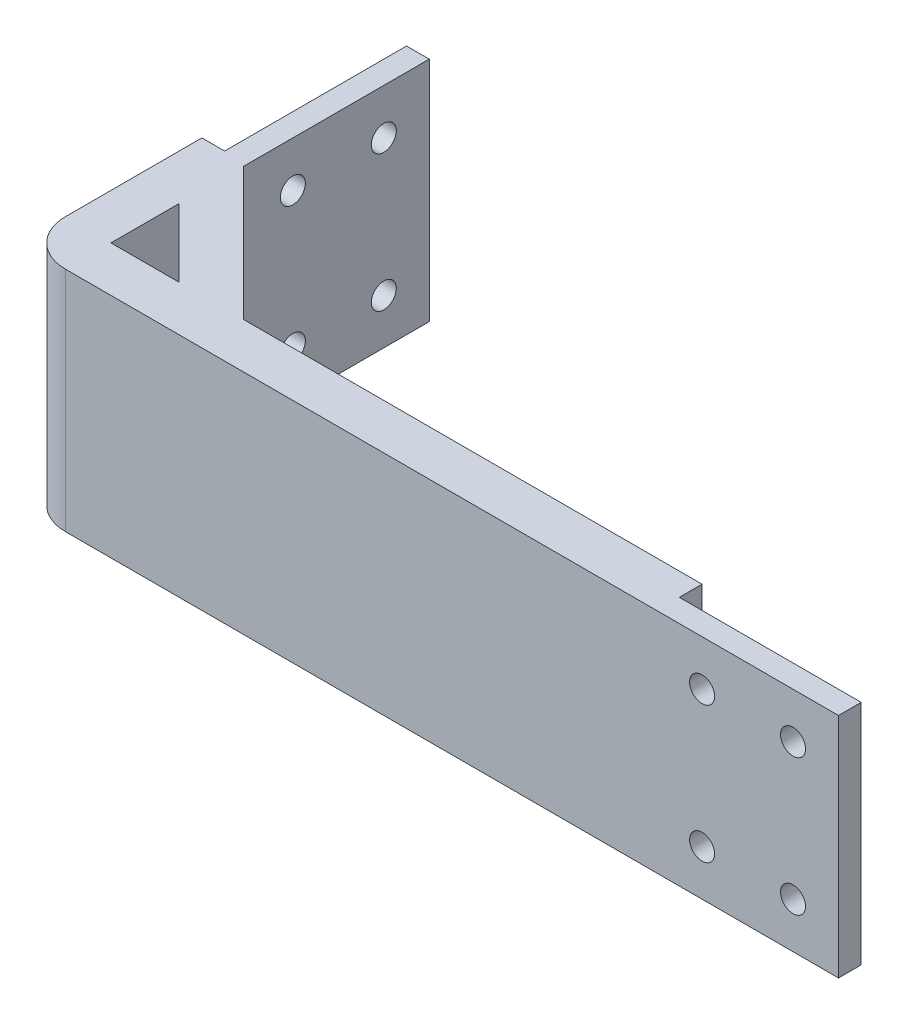
ISO-10303-21;
HEADER;
FILE_DESCRIPTION(('STEP AP214'),'2;1');
FILE_NAME('part.step','',(''),(''),'','','');
FILE_SCHEMA(('AUTOMOTIVE_DESIGN { 1 0 10303 214 1 1 1 1 }'));
ENDSEC;
DATA;
#1=APPLICATION_CONTEXT('core data for automotive mechanical design processes');
#2=APPLICATION_PROTOCOL_DEFINITION('international standard','automotive_design',2000,#1);
#3=PRODUCT_CONTEXT('',#1,'mechanical');
#4=PRODUCT('Part','Part','',(#3));
#5=PRODUCT_RELATED_PRODUCT_CATEGORY('part','',(#4));
#6=PRODUCT_DEFINITION_FORMATION('','',#4);
#7=PRODUCT_DEFINITION_CONTEXT('part definition',#1,'design');
#8=PRODUCT_DEFINITION('design','',#6,#7);
#9=PRODUCT_DEFINITION_SHAPE('','',#8);
#10=(LENGTH_UNIT() NAMED_UNIT(*) SI_UNIT(.MILLI.,.METRE.));
#11=(NAMED_UNIT(*) PLANE_ANGLE_UNIT() SI_UNIT($,.RADIAN.));
#12=(NAMED_UNIT(*) SI_UNIT($,.STERADIAN.) SOLID_ANGLE_UNIT());
#13=UNCERTAINTY_MEASURE_WITH_UNIT(LENGTH_MEASURE(1.E-05),#10,'distance_accuracy_value','');
#14=(GEOMETRIC_REPRESENTATION_CONTEXT(3) GLOBAL_UNCERTAINTY_ASSIGNED_CONTEXT((#13)) GLOBAL_UNIT_ASSIGNED_CONTEXT((#10,
#11,#12)) REPRESENTATION_CONTEXT('',''));
#15=CARTESIAN_POINT('',(0.,0.,0.));
#16=DIRECTION('',(0.,0.,1.));
#17=DIRECTION('',(1.,0.,0.));
#18=AXIS2_PLACEMENT_3D('',#15,#16,#17);
#19=CARTESIAN_POINT('',(0.,50.,-80.));
#20=DIRECTION('',(0.,0.,1.));
#21=DIRECTION('',(1.,0.,0.));
#22=AXIS2_PLACEMENT_3D('',#19,#20,#21);
#23=PLANE('',#22);
#24=DIRECTION('',(0.,-1.,0.));
#25=VECTOR('',#24,1.);
#26=CARTESIAN_POINT('',(5.00000000000001,50.,-80.));
#27=LINE('',#26,#25);
#28=CARTESIAN_POINT('',(5.00000000000001,50.,-80.));
#29=VERTEX_POINT('',#28);
#30=CARTESIAN_POINT('',(5.00000000000001,0.,-80.));
#31=VERTEX_POINT('',#30);
#32=EDGE_CURVE('E150',#29,#31,#27,.T.);
#33=ORIENTED_EDGE('',*,*,#32,.F.);
#34=DIRECTION('',(-1.,0.,0.));
#35=VECTOR('',#34,1.);
#36=CARTESIAN_POINT('',(0.,50.,-80.));
#37=LINE('',#36,#35);
#38=CARTESIAN_POINT('',(10.,50.,-80.));
#39=VERTEX_POINT('',#38);
#40=EDGE_CURVE('E282',#39,#29,#37,.T.);
#41=ORIENTED_EDGE('',*,*,#40,.F.);
#42=DIRECTION('',(0.,-1.,0.));
#43=VECTOR('',#42,1.);
#44=CARTESIAN_POINT('',(10.,50.,-80.));
#45=LINE('',#44,#43);
#46=CARTESIAN_POINT('',(10.,0.,-80.));
#47=VERTEX_POINT('',#46);
#48=EDGE_CURVE('E172',#39,#47,#45,.T.);
#49=ORIENTED_EDGE('',*,*,#48,.T.);
#50=DIRECTION('',(-1.,0.,0.));
#51=VECTOR('',#50,1.);
#52=CARTESIAN_POINT('',(0.,0.,-80.));
#53=LINE('',#52,#51);
#54=EDGE_CURVE('E166',#47,#31,#53,.T.);
#55=ORIENTED_EDGE('',*,*,#54,.T.);
#56=EDGE_LOOP('',(#33,#41,#49,#55));
#57=FACE_BOUND('',#56,.T.);
#58=ADVANCED_FACE('F43',(#57),#23,.F.);
#59=CARTESIAN_POINT('',(180.,50.,0.));
#60=DIRECTION('',(-1.,0.,0.));
#61=DIRECTION('',(0.,0.,1.));
#62=AXIS2_PLACEMENT_3D('',#59,#60,#61);
#63=PLANE('',#62);
#64=DIRECTION('',(0.,1.,0.));
#65=VECTOR('',#64,1.);
#66=CARTESIAN_POINT('',(180.,50.,-4.99999999999999));
#67=LINE('',#66,#65);
#68=CARTESIAN_POINT('',(180.,0.,-4.99999999999999));
#69=VERTEX_POINT('',#68);
#70=CARTESIAN_POINT('',(180.,50.,-4.99999999999999));
#71=VERTEX_POINT('',#70);
#72=EDGE_CURVE('E251',#69,#71,#67,.T.);
#73=ORIENTED_EDGE('',*,*,#72,.T.);
#74=DIRECTION('',(0.,0.,-1.));
#75=VECTOR('',#74,1.);
#76=CARTESIAN_POINT('',(180.,50.,0.));
#77=LINE('',#76,#75);
#78=CARTESIAN_POINT('',(180.,50.,0.));
#79=VERTEX_POINT('',#78);
#80=EDGE_CURVE('E253',#79,#71,#77,.T.);
#81=ORIENTED_EDGE('',*,*,#80,.F.);
#82=DIRECTION('',(0.,-1.,0.));
#83=VECTOR('',#82,1.);
#84=CARTESIAN_POINT('',(180.,50.,0.));
#85=LINE('',#84,#83);
#86=CARTESIAN_POINT('',(180.,0.,0.));
#87=VERTEX_POINT('',#86);
#88=EDGE_CURVE('E206',#79,#87,#85,.T.);
#89=ORIENTED_EDGE('',*,*,#88,.T.);
#90=DIRECTION('',(0.,0.,-1.));
#91=VECTOR('',#90,1.);
#92=CARTESIAN_POINT('',(180.,0.,0.));
#93=LINE('',#92,#91);
#94=EDGE_CURVE('E184',#87,#69,#93,.T.);
#95=ORIENTED_EDGE('',*,*,#94,.T.);
#96=EDGE_LOOP('',(#73,#81,#89,#95));
#97=FACE_BOUND('',#96,.T.);
#98=ADVANCED_FACE('F249',(#97),#63,.F.);
#99=CARTESIAN_POINT('',(0.,50.,-9.99999999999999));
#100=DIRECTION('',(0.,0.,1.));
#101=DIRECTION('',(1.,0.,0.));
#102=AXIS2_PLACEMENT_3D('',#99,#100,#101);
#103=PLANE('',#102);
#104=DIRECTION('',(0.,-1.,0.));
#105=VECTOR('',#104,1.);
#106=CARTESIAN_POINT('',(140.,50.,-9.99999999999999));
#107=LINE('',#106,#105);
#108=CARTESIAN_POINT('',(140.,50.,-9.99999999999999));
#109=VERTEX_POINT('',#108);
#110=CARTESIAN_POINT('',(140.,0.,-9.99999999999999));
#111=VERTEX_POINT('',#110);
#112=EDGE_CURVE('E352',#109,#111,#107,.T.);
#113=ORIENTED_EDGE('',*,*,#112,.T.);
#114=DIRECTION('',(-1.,0.,0.));
#115=VECTOR('',#114,1.);
#116=CARTESIAN_POINT('',(0.,0.,-9.99999999999999));
#117=LINE('',#116,#115);
#118=CARTESIAN_POINT('',(39.142135623731,0.,-10.));
#119=VERTEX_POINT('',#118);
#120=EDGE_CURVE('E187',#111,#119,#117,.T.);
#121=ORIENTED_EDGE('',*,*,#120,.T.);
#122=DIRECTION('',(0.,-1.,0.));
#123=VECTOR('',#122,1.);
#124=CARTESIAN_POINT('',(39.142135623731,50.,-10.));
#125=LINE('',#124,#123);
#126=CARTESIAN_POINT('',(39.142135623731,50.,-10.));
#127=VERTEX_POINT('',#126);
#128=EDGE_CURVE('E203',#127,#119,#125,.T.);
#129=ORIENTED_EDGE('',*,*,#128,.F.);
#130=DIRECTION('',(-1.,0.,0.));
#131=VECTOR('',#130,1.);
#132=CARTESIAN_POINT('',(0.,50.,-9.99999999999999));
#133=LINE('',#132,#131);
#134=EDGE_CURVE('E256',#109,#127,#133,.T.);
#135=ORIENTED_EDGE('',*,*,#134,.F.);
#136=EDGE_LOOP('',(#113,#121,#129,#135));
#137=FACE_BOUND('',#136,.T.);
#138=ADVANCED_FACE('F304',(#137),#103,.F.);
#139=CARTESIAN_POINT('',(0.,50.,0.));
#140=DIRECTION('',(0.,1.,0.));
#141=DIRECTION('',(0.,0.,1.));
#142=AXIS2_PLACEMENT_3D('',#139,#140,#141);
#143=PLANE('',#142);
#144=DIRECTION('',(0.,0.,1.));
#145=VECTOR('',#144,1.);
#146=CARTESIAN_POINT('',(0.,50.,0.));
#147=LINE('',#146,#145);
#148=CARTESIAN_POINT('',(0.,50.,-40.));
#149=VERTEX_POINT('',#148);
#150=CARTESIAN_POINT('',(0.,50.,-10.));
#151=VERTEX_POINT('',#150);
#152=EDGE_CURVE('E260',#149,#151,#147,.T.);
#153=ORIENTED_EDGE('',*,*,#152,.T.);
#154=CARTESIAN_POINT('',(10.,50.,-10.));
#155=DIRECTION('',(0.,1.,0.));
#156=DIRECTION('',(0.,0.,1.));
#157=AXIS2_PLACEMENT_3D('',#154,#155,#156);
#158=CIRCLE('',#157,10.);
#159=CARTESIAN_POINT('',(10.,50.,0.));
#160=VERTEX_POINT('',#159);
#161=EDGE_CURVE('E11',#151,#160,#158,.T.);
#162=ORIENTED_EDGE('',*,*,#161,.T.);
#163=DIRECTION('',(1.,0.,0.));
#164=VECTOR('',#163,1.);
#165=CARTESIAN_POINT('',(0.,50.,0.));
#166=LINE('',#165,#164);
#167=EDGE_CURVE('E239',#160,#79,#166,.T.);
#168=ORIENTED_EDGE('',*,*,#167,.T.);
#169=ORIENTED_EDGE('',*,*,#80,.T.);
#170=DIRECTION('',(-1.,0.,0.));
#171=VECTOR('',#170,1.);
#172=CARTESIAN_POINT('',(180.,50.,-4.99999999999999));
#173=LINE('',#172,#171);
#174=CARTESIAN_POINT('',(140.,50.,-4.99999999999999));
#175=VERTEX_POINT('',#174);
#176=EDGE_CURVE('E362',#71,#175,#173,.T.);
#177=ORIENTED_EDGE('',*,*,#176,.T.);
#178=DIRECTION('',(0.,0.,-1.));
#179=VECTOR('',#178,1.);
#180=CARTESIAN_POINT('',(140.,50.,-4.99999999999999));
#181=LINE('',#180,#179);
#182=EDGE_CURVE('E266',#175,#109,#181,.T.);
#183=ORIENTED_EDGE('',*,*,#182,.T.);
#184=ORIENTED_EDGE('',*,*,#134,.T.);
#185=DIRECTION('',(-0.707106781186548,0.,-0.707106781186547));
#186=VECTOR('',#185,1.);
#187=CARTESIAN_POINT('',(24.5710678118655,50.,-24.5710678118655));
#188=LINE('',#187,#186);
#189=CARTESIAN_POINT('',(10.,50.,-39.1421356237309));
#190=VERTEX_POINT('',#189);
#191=EDGE_CURVE('E277',#127,#190,#188,.T.);
#192=ORIENTED_EDGE('',*,*,#191,.T.);
#193=DIRECTION('',(0.,0.,-1.));
#194=VECTOR('',#193,1.);
#195=CARTESIAN_POINT('',(9.99999999999999,50.,0.));
#196=LINE('',#195,#194);
#197=EDGE_CURVE('E280',#190,#39,#196,.T.);
#198=ORIENTED_EDGE('',*,*,#197,.T.);
#199=ORIENTED_EDGE('',*,*,#40,.T.);
#200=DIRECTION('',(0.,0.,-1.));
#201=VECTOR('',#200,1.);
#202=CARTESIAN_POINT('',(5.00000000000001,50.,-80.));
#203=LINE('',#202,#201);
#204=CARTESIAN_POINT('',(5.,50.,-40.));
#205=VERTEX_POINT('',#204);
#206=EDGE_CURVE('E157',#205,#29,#203,.T.);
#207=ORIENTED_EDGE('',*,*,#206,.F.);
#208=DIRECTION('',(-1.,0.,0.));
#209=VECTOR('',#208,1.);
#210=CARTESIAN_POINT('',(5.,50.,-40.));
#211=LINE('',#210,#209);
#212=EDGE_CURVE('E286',#205,#149,#211,.T.);
#213=ORIENTED_EDGE('',*,*,#212,.T.);
#214=EDGE_LOOP('',(#153,#162,#168,#169,#177,#183,#184,#192,#198,#199,#207,#213));
#215=FACE_BOUND('',#214,.T.);
#216=CARTESIAN_POINT('',(9.99999999999999,50.,-9.99999999999999));
#217=VERTEX_POINT('',#216);
#218=CARTESIAN_POINT('',(10.,50.,-25.));
#219=VERTEX_POINT('',#218);
#220=EDGE_CURVE('E258',#217,#219,#196,.T.);
#221=ORIENTED_EDGE('',*,*,#220,.T.);
#222=DIRECTION('',(0.707106781186548,0.,0.707106781186548));
#223=VECTOR('',#222,1.);
#224=CARTESIAN_POINT('',(17.5,50.,-17.5));
#225=LINE('',#224,#223);
#226=CARTESIAN_POINT('',(25.,50.,-9.99999999999999));
#227=VERTEX_POINT('',#226);
#228=EDGE_CURVE('E264',#219,#227,#225,.T.);
#229=ORIENTED_EDGE('',*,*,#228,.T.);
#230=EDGE_CURVE('E207',#227,#217,#133,.T.);
#231=ORIENTED_EDGE('',*,*,#230,.T.);
#232=EDGE_LOOP('',(#221,#229,#231));
#233=FACE_BOUND('',#232,.T.);
#234=ADVANCED_FACE('F284',(#215,#233),#143,.T.);
#235=CARTESIAN_POINT('',(0.,0.,0.));
#236=DIRECTION('',(0.,1.,0.));
#237=DIRECTION('',(0.,0.,1.));
#238=AXIS2_PLACEMENT_3D('',#235,#236,#237);
#239=PLANE('',#238);
#240=DIRECTION('',(0.,0.,-1.));
#241=VECTOR('',#240,1.);
#242=CARTESIAN_POINT('',(9.99999999999999,0.,0.));
#243=LINE('',#242,#241);
#244=CARTESIAN_POINT('',(9.99999999999999,0.,-9.99999999999999));
#245=VERTEX_POINT('',#244);
#246=CARTESIAN_POINT('',(10.,0.,-25.));
#247=VERTEX_POINT('',#246);
#248=EDGE_CURVE('E180',#245,#247,#243,.T.);
#249=ORIENTED_EDGE('',*,*,#248,.F.);
#250=CARTESIAN_POINT('',(25.,0.,-9.99999999999999));
#251=VERTEX_POINT('',#250);
#252=EDGE_CURVE('E189',#251,#245,#117,.T.);
#253=ORIENTED_EDGE('',*,*,#252,.F.);
#254=DIRECTION('',(0.707106781186548,0.,0.707106781186548));
#255=VECTOR('',#254,1.);
#256=CARTESIAN_POINT('',(17.5,0.,-17.5));
#257=LINE('',#256,#255);
#258=EDGE_CURVE('E190',#247,#251,#257,.T.);
#259=ORIENTED_EDGE('',*,*,#258,.F.);
#260=EDGE_LOOP('',(#249,#253,#259));
#261=FACE_BOUND('',#260,.T.);
#262=DIRECTION('',(1.,0.,0.));
#263=VECTOR('',#262,1.);
#264=CARTESIAN_POINT('',(0.,0.,0.));
#265=LINE('',#264,#263);
#266=CARTESIAN_POINT('',(10.,0.,0.));
#267=VERTEX_POINT('',#266);
#268=EDGE_CURVE('E176',#267,#87,#265,.T.);
#269=ORIENTED_EDGE('',*,*,#268,.F.);
#270=CARTESIAN_POINT('',(10.,0.,-10.));
#271=DIRECTION('',(0.,1.,0.));
#272=DIRECTION('',(0.,0.,1.));
#273=AXIS2_PLACEMENT_3D('',#270,#271,#272);
#274=CIRCLE('',#273,10.);
#275=CARTESIAN_POINT('',(0.,0.,-10.));
#276=VERTEX_POINT('',#275);
#277=EDGE_CURVE('E65',#267,#276,#274,.F.);
#278=ORIENTED_EDGE('',*,*,#277,.T.);
#279=DIRECTION('',(0.,0.,1.));
#280=VECTOR('',#279,1.);
#281=CARTESIAN_POINT('',(0.,0.,0.));
#282=LINE('',#281,#280);
#283=CARTESIAN_POINT('',(0.,0.,-40.));
#284=VERTEX_POINT('',#283);
#285=EDGE_CURVE('E173',#284,#276,#282,.T.);
#286=ORIENTED_EDGE('',*,*,#285,.F.);
#287=DIRECTION('',(-1.,0.,0.));
#288=VECTOR('',#287,1.);
#289=CARTESIAN_POINT('',(5.,0.,-40.));
#290=LINE('',#289,#288);
#291=CARTESIAN_POINT('',(5.,0.,-40.));
#292=VERTEX_POINT('',#291);
#293=EDGE_CURVE('E167',#292,#284,#290,.T.);
#294=ORIENTED_EDGE('',*,*,#293,.F.);
#295=DIRECTION('',(0.,0.,1.));
#296=VECTOR('',#295,1.);
#297=CARTESIAN_POINT('',(5.00000000000001,0.,-80.));
#298=LINE('',#297,#296);
#299=EDGE_CURVE('E154',#31,#292,#298,.T.);
#300=ORIENTED_EDGE('',*,*,#299,.F.);
#301=ORIENTED_EDGE('',*,*,#54,.F.);
#302=CARTESIAN_POINT('',(10.,0.,-39.1421356237309));
#303=VERTEX_POINT('',#302);
#304=EDGE_CURVE('E174',#303,#47,#243,.T.);
#305=ORIENTED_EDGE('',*,*,#304,.F.);
#306=DIRECTION('',(-0.707106781186548,0.,-0.707106781186547));
#307=VECTOR('',#306,1.);
#308=CARTESIAN_POINT('',(24.5710678118655,0.,-24.5710678118655));
#309=LINE('',#308,#307);
#310=EDGE_CURVE('E178',#119,#303,#309,.T.);
#311=ORIENTED_EDGE('',*,*,#310,.F.);
#312=ORIENTED_EDGE('',*,*,#120,.F.);
#313=DIRECTION('',(0.,0.,-1.));
#314=VECTOR('',#313,1.);
#315=CARTESIAN_POINT('',(140.,0.,-4.99999999999999));
#316=LINE('',#315,#314);
#317=CARTESIAN_POINT('',(140.,0.,-4.99999999999999));
#318=VERTEX_POINT('',#317);
#319=EDGE_CURVE('E271',#318,#111,#316,.T.);
#320=ORIENTED_EDGE('',*,*,#319,.F.);
#321=DIRECTION('',(1.,0.,0.));
#322=VECTOR('',#321,1.);
#323=CARTESIAN_POINT('',(180.,0.,-4.99999999999999));
#324=LINE('',#323,#322);
#325=EDGE_CURVE('E246',#318,#69,#324,.T.);
#326=ORIENTED_EDGE('',*,*,#325,.T.);
#327=ORIENTED_EDGE('',*,*,#94,.F.);
#328=EDGE_LOOP('',(#269,#278,#286,#294,#300,#301,#305,#311,#312,#320,#326,#327));
#329=FACE_BOUND('',#328,.T.);
#330=ADVANCED_FACE('F165',(#261,#329),#239,.F.);
#331=CARTESIAN_POINT('',(9.99999999999999,50.,0.));
#332=DIRECTION('',(-1.,0.,0.));
#333=DIRECTION('',(0.,0.,1.));
#334=AXIS2_PLACEMENT_3D('',#331,#332,#333);
#335=PLANE('',#334);
#336=ORIENTED_EDGE('',*,*,#248,.T.);
#337=DIRECTION('',(0.,-1.,0.));
#338=VECTOR('',#337,1.);
#339=CARTESIAN_POINT('',(10.,50.,-25.));
#340=LINE('',#339,#338);
#341=EDGE_CURVE('E199',#219,#247,#340,.T.);
#342=ORIENTED_EDGE('',*,*,#341,.F.);
#343=ORIENTED_EDGE('',*,*,#220,.F.);
#344=DIRECTION('',(0.,-1.,0.));
#345=VECTOR('',#344,1.);
#346=CARTESIAN_POINT('',(9.99999999999999,50.,-9.99999999999999));
#347=LINE('',#346,#345);
#348=EDGE_CURVE('E192',#217,#245,#347,.T.);
#349=ORIENTED_EDGE('',*,*,#348,.T.);
#350=EDGE_LOOP('',(#336,#342,#343,#349));
#351=FACE_BOUND('',#350,.T.);
#352=ADVANCED_FACE('F320',(#351),#335,.F.);
#353=CARTESIAN_POINT('',(17.5,50.,-17.5));
#354=DIRECTION('',(0.707106781186548,0.,-0.707106781186548));
#355=DIRECTION('',(-0.707106781186548,0.,-0.707106781186548));
#356=AXIS2_PLACEMENT_3D('',#353,#354,#355);
#357=PLANE('',#356);
#358=ORIENTED_EDGE('',*,*,#258,.T.);
#359=DIRECTION('',(0.,-1.,0.));
#360=VECTOR('',#359,1.);
#361=CARTESIAN_POINT('',(25.,50.,-9.99999999999999));
#362=LINE('',#361,#360);
#363=EDGE_CURVE('E195',#227,#251,#362,.T.);
#364=ORIENTED_EDGE('',*,*,#363,.F.);
#365=ORIENTED_EDGE('',*,*,#228,.F.);
#366=ORIENTED_EDGE('',*,*,#341,.T.);
#367=EDGE_LOOP('',(#358,#364,#365,#366));
#368=FACE_BOUND('',#367,.T.);
#369=ADVANCED_FACE('F312',(#368),#357,.F.);
#370=CARTESIAN_POINT('',(24.5710678118655,50.,-24.5710678118655));
#371=DIRECTION('',(-0.707106781186547,0.,0.707106781186548));
#372=DIRECTION('',(0.707106781186548,0.,0.707106781186547));
#373=AXIS2_PLACEMENT_3D('',#370,#371,#372);
#374=PLANE('',#373);
#375=ORIENTED_EDGE('',*,*,#310,.T.);
#376=DIRECTION('',(0.,-1.,0.));
#377=VECTOR('',#376,1.);
#378=CARTESIAN_POINT('',(10.,50.,-39.1421356237309));
#379=LINE('',#378,#377);
#380=EDGE_CURVE('E196',#190,#303,#379,.T.);
#381=ORIENTED_EDGE('',*,*,#380,.F.);
#382=ORIENTED_EDGE('',*,*,#191,.F.);
#383=ORIENTED_EDGE('',*,*,#128,.T.);
#384=EDGE_LOOP('',(#375,#381,#382,#383));
#385=FACE_BOUND('',#384,.T.);
#386=ADVANCED_FACE('F309',(#385),#374,.F.);
#387=CARTESIAN_POINT('',(10.,10.,-50.));
#388=DIRECTION('',(-1.,0.,0.));
#389=DIRECTION('',(0.,0.,1.));
#390=AXIS2_PLACEMENT_3D('',#387,#388,#389);
#391=CIRCLE('',#390,2.74999999999997);
#392=CARTESIAN_POINT('',(10.,10.,-47.25));
#393=VERTEX_POINT('',#392);
#394=EDGE_CURVE('E227',#393,#393,#391,.T.);
#395=ORIENTED_EDGE('',*,*,#394,.T.);
#396=EDGE_LOOP('',(#395));
#397=FACE_BOUND('',#396,.T.);
#398=CARTESIAN_POINT('',(10.,40.,-50.));
#399=DIRECTION('',(-1.,0.,0.));
#400=DIRECTION('',(0.,0.,1.));
#401=AXIS2_PLACEMENT_3D('',#398,#399,#400);
#402=CIRCLE('',#401,2.74999999999997);
#403=CARTESIAN_POINT('',(10.,40.,-47.25));
#404=VERTEX_POINT('',#403);
#405=EDGE_CURVE('E222',#404,#404,#402,.T.);
#406=ORIENTED_EDGE('',*,*,#405,.T.);
#407=EDGE_LOOP('',(#406));
#408=FACE_BOUND('',#407,.T.);
#409=CARTESIAN_POINT('',(10.,10.,-70.));
#410=DIRECTION('',(-1.,0.,0.));
#411=DIRECTION('',(0.,0.,1.));
#412=AXIS2_PLACEMENT_3D('',#409,#410,#411);
#413=CIRCLE('',#412,2.74999999999997);
#414=CARTESIAN_POINT('',(10.,10.,-67.25));
#415=VERTEX_POINT('',#414);
#416=EDGE_CURVE('E217',#415,#415,#413,.T.);
#417=ORIENTED_EDGE('',*,*,#416,.T.);
#418=EDGE_LOOP('',(#417));
#419=FACE_BOUND('',#418,.T.);
#420=CARTESIAN_POINT('',(10.,40.,-70.));
#421=DIRECTION('',(-1.,0.,0.));
#422=DIRECTION('',(0.,0.,1.));
#423=AXIS2_PLACEMENT_3D('',#420,#421,#422);
#424=CIRCLE('',#423,2.74999999999997);
#425=CARTESIAN_POINT('',(10.,40.,-67.25));
#426=VERTEX_POINT('',#425);
#427=EDGE_CURVE('E213',#426,#426,#424,.T.);
#428=ORIENTED_EDGE('',*,*,#427,.T.);
#429=EDGE_LOOP('',(#428));
#430=FACE_BOUND('',#429,.T.);
#431=ORIENTED_EDGE('',*,*,#304,.T.);
#432=ORIENTED_EDGE('',*,*,#48,.F.);
#433=ORIENTED_EDGE('',*,*,#197,.F.);
#434=ORIENTED_EDGE('',*,*,#380,.T.);
#435=EDGE_LOOP('',(#431,#432,#433,#434));
#436=FACE_BOUND('',#435,.T.);
#437=ADVANCED_FACE('F311',(#397,#408,#419,#430,#436),#335,.F.);
#438=CARTESIAN_POINT('',(0.,50.,0.));
#439=DIRECTION('',(1.,0.,0.));
#440=DIRECTION('',(0.,0.,-1.));
#441=AXIS2_PLACEMENT_3D('',#438,#439,#440);
#442=PLANE('',#441);
#443=ORIENTED_EDGE('',*,*,#285,.T.);
#444=DIRECTION('',(0.,-1.,0.));
#445=VECTOR('',#444,1.);
#446=CARTESIAN_POINT('',(0.,50.,-10.));
#447=LINE('',#446,#445);
#448=EDGE_CURVE('E51',#276,#151,#447,.F.);
#449=ORIENTED_EDGE('',*,*,#448,.T.);
#450=ORIENTED_EDGE('',*,*,#152,.F.);
#451=DIRECTION('',(0.,1.,0.));
#452=VECTOR('',#451,1.);
#453=CARTESIAN_POINT('',(0.,50.,-40.));
#454=LINE('',#453,#452);
#455=EDGE_CURVE('E162',#284,#149,#454,.T.);
#456=ORIENTED_EDGE('',*,*,#455,.F.);
#457=EDGE_LOOP('',(#443,#449,#450,#456));
#458=FACE_BOUND('',#457,.T.);
#459=ADVANCED_FACE('F307',(#458),#442,.F.);
#460=CARTESIAN_POINT('',(0.,50.,0.));
#461=DIRECTION('',(0.,0.,-1.));
#462=DIRECTION('',(-1.,0.,0.));
#463=AXIS2_PLACEMENT_3D('',#460,#461,#462);
#464=PLANE('',#463);
#465=CARTESIAN_POINT('',(170.,10.,0.));
#466=DIRECTION('',(0.,0.,-1.));
#467=DIRECTION('',(-1.,0.,0.));
#468=AXIS2_PLACEMENT_3D('',#465,#466,#467);
#469=CIRCLE('',#468,2.74999999999997);
#470=CARTESIAN_POINT('',(167.25,10.,0.));
#471=VERTEX_POINT('',#470);
#472=EDGE_CURVE('E339',#471,#471,#469,.T.);
#473=ORIENTED_EDGE('',*,*,#472,.T.);
#474=EDGE_LOOP('',(#473));
#475=FACE_BOUND('',#474,.T.);
#476=CARTESIAN_POINT('',(150.,10.,0.));
#477=DIRECTION('',(0.,0.,-1.));
#478=DIRECTION('',(-1.,0.,0.));
#479=AXIS2_PLACEMENT_3D('',#476,#477,#478);
#480=CIRCLE('',#479,2.74999999999997);
#481=CARTESIAN_POINT('',(147.25,10.,0.));
#482=VERTEX_POINT('',#481);
#483=EDGE_CURVE('E343',#482,#482,#480,.T.);
#484=ORIENTED_EDGE('',*,*,#483,.T.);
#485=EDGE_LOOP('',(#484));
#486=FACE_BOUND('',#485,.T.);
#487=CARTESIAN_POINT('',(150.,40.,0.));
#488=DIRECTION('',(0.,0.,-1.));
#489=DIRECTION('',(-1.,0.,0.));
#490=AXIS2_PLACEMENT_3D('',#487,#488,#489);
#491=CIRCLE('',#490,2.74999999999997);
#492=CARTESIAN_POINT('',(147.25,40.,0.));
#493=VERTEX_POINT('',#492);
#494=EDGE_CURVE('E347',#493,#493,#491,.T.);
#495=ORIENTED_EDGE('',*,*,#494,.T.);
#496=EDGE_LOOP('',(#495));
#497=FACE_BOUND('',#496,.T.);
#498=CARTESIAN_POINT('',(170.,40.,0.));
#499=DIRECTION('',(0.,0.,-1.));
#500=DIRECTION('',(-1.,0.,0.));
#501=AXIS2_PLACEMENT_3D('',#498,#499,#500);
#502=CIRCLE('',#501,2.74999999999997);
#503=CARTESIAN_POINT('',(167.25,40.,0.));
#504=VERTEX_POINT('',#503);
#505=EDGE_CURVE('E350',#504,#504,#502,.T.);
#506=ORIENTED_EDGE('',*,*,#505,.T.);
#507=EDGE_LOOP('',(#506));
#508=FACE_BOUND('',#507,.T.);
#509=ORIENTED_EDGE('',*,*,#167,.F.);
#510=DIRECTION('',(0.,-1.,0.));
#511=VECTOR('',#510,1.);
#512=CARTESIAN_POINT('',(10.,50.,0.));
#513=LINE('',#512,#511);
#514=EDGE_CURVE('E202',#160,#267,#513,.T.);
#515=ORIENTED_EDGE('',*,*,#514,.T.);
#516=ORIENTED_EDGE('',*,*,#268,.T.);
#517=ORIENTED_EDGE('',*,*,#88,.F.);
#518=EDGE_LOOP('',(#509,#515,#516,#517));
#519=FACE_BOUND('',#518,.T.);
#520=ADVANCED_FACE('F237',(#475,#486,#497,#508,#519),#464,.F.);
#521=ORIENTED_EDGE('',*,*,#252,.T.);
#522=ORIENTED_EDGE('',*,*,#348,.F.);
#523=ORIENTED_EDGE('',*,*,#230,.F.);
#524=ORIENTED_EDGE('',*,*,#363,.T.);
#525=EDGE_LOOP('',(#521,#522,#523,#524));
#526=FACE_BOUND('',#525,.T.);
#527=ADVANCED_FACE('F328',(#526),#103,.F.);
#528=CARTESIAN_POINT('',(140.,50.,-4.99999999999999));
#529=DIRECTION('',(1.,0.,0.));
#530=DIRECTION('',(0.,0.,-1.));
#531=AXIS2_PLACEMENT_3D('',#528,#529,#530);
#532=PLANE('',#531);
#533=ORIENTED_EDGE('',*,*,#112,.F.);
#534=ORIENTED_EDGE('',*,*,#182,.F.);
#535=DIRECTION('',(0.,-1.,0.));
#536=VECTOR('',#535,1.);
#537=CARTESIAN_POINT('',(140.,50.,-4.99999999999999));
#538=LINE('',#537,#536);
#539=EDGE_CURVE('E364',#175,#318,#538,.T.);
#540=ORIENTED_EDGE('',*,*,#539,.T.);
#541=ORIENTED_EDGE('',*,*,#319,.T.);
#542=EDGE_LOOP('',(#533,#534,#540,#541));
#543=FACE_BOUND('',#542,.T.);
#544=ADVANCED_FACE('F334',(#543),#532,.T.);
#545=CARTESIAN_POINT('',(0.,0.,-4.99999999999999));
#546=DIRECTION('',(0.,0.,-1.));
#547=DIRECTION('',(-1.,0.,0.));
#548=AXIS2_PLACEMENT_3D('',#545,#546,#547);
#549=PLANE('',#548);
#550=CARTESIAN_POINT('',(170.,10.,-5.));
#551=DIRECTION('',(0.,0.,-1.));
#552=DIRECTION('',(-1.,0.,0.));
#553=AXIS2_PLACEMENT_3D('',#550,#551,#552);
#554=CIRCLE('',#553,2.775);
#555=CARTESIAN_POINT('',(167.225,10.,-5.));
#556=VERTEX_POINT('',#555);
#557=EDGE_CURVE('E380',#556,#556,#554,.T.);
#558=ORIENTED_EDGE('',*,*,#557,.F.);
#559=EDGE_LOOP('',(#558));
#560=FACE_BOUND('',#559,.T.);
#561=CARTESIAN_POINT('',(150.,10.,-5.));
#562=DIRECTION('',(0.,0.,-1.));
#563=DIRECTION('',(-1.,0.,0.));
#564=AXIS2_PLACEMENT_3D('',#561,#562,#563);
#565=CIRCLE('',#564,2.775);
#566=CARTESIAN_POINT('',(147.225,10.,-5.));
#567=VERTEX_POINT('',#566);
#568=EDGE_CURVE('E388',#567,#567,#565,.T.);
#569=ORIENTED_EDGE('',*,*,#568,.F.);
#570=EDGE_LOOP('',(#569));
#571=FACE_BOUND('',#570,.T.);
#572=CARTESIAN_POINT('',(150.,40.,-5.));
#573=DIRECTION('',(0.,0.,-1.));
#574=DIRECTION('',(-1.,0.,0.));
#575=AXIS2_PLACEMENT_3D('',#572,#573,#574);
#576=CIRCLE('',#575,2.775);
#577=CARTESIAN_POINT('',(147.225,40.,-5.));
#578=VERTEX_POINT('',#577);
#579=EDGE_CURVE('E395',#578,#578,#576,.T.);
#580=ORIENTED_EDGE('',*,*,#579,.F.);
#581=EDGE_LOOP('',(#580));
#582=FACE_BOUND('',#581,.T.);
#583=CARTESIAN_POINT('',(170.,40.,-5.));
#584=DIRECTION('',(0.,0.,-1.));
#585=DIRECTION('',(-1.,0.,0.));
#586=AXIS2_PLACEMENT_3D('',#583,#584,#585);
#587=CIRCLE('',#586,2.775);
#588=CARTESIAN_POINT('',(167.225,40.,-5.));
#589=VERTEX_POINT('',#588);
#590=EDGE_CURVE('E357',#589,#589,#587,.T.);
#591=ORIENTED_EDGE('',*,*,#590,.F.);
#592=EDGE_LOOP('',(#591));
#593=FACE_BOUND('',#592,.T.);
#594=ORIENTED_EDGE('',*,*,#72,.F.);
#595=ORIENTED_EDGE('',*,*,#325,.F.);
#596=ORIENTED_EDGE('',*,*,#539,.F.);
#597=ORIENTED_EDGE('',*,*,#176,.F.);
#598=EDGE_LOOP('',(#594,#595,#596,#597));
#599=FACE_BOUND('',#598,.T.);
#600=ADVANCED_FACE('F369',(#560,#571,#582,#593,#599),#549,.T.);
#601=CARTESIAN_POINT('',(170.,40.,-4.99999999999999));
#602=DIRECTION('',(0.,0.,-1.));
#603=DIRECTION('',(-1.,0.,0.));
#604=AXIS2_PLACEMENT_3D('',#601,#602,#603);
#605=CYLINDRICAL_SURFACE('',#604,2.74999999999997);
#606=ORIENTED_EDGE('',*,*,#505,.F.);
#607=EDGE_LOOP('',(#606));
#608=FACE_BOUND('',#607,.T.);
#609=CARTESIAN_POINT('',(170.,40.,-4.975));
#610=DIRECTION('',(0.,0.,-1.));
#611=DIRECTION('',(-1.,0.,0.));
#612=AXIS2_PLACEMENT_3D('',#609,#610,#611);
#613=CIRCLE('',#612,2.74999999999997);
#614=CARTESIAN_POINT('',(167.25,40.,-4.975));
#615=VERTEX_POINT('',#614);
#616=EDGE_CURVE('E353',#615,#615,#613,.T.);
#617=ORIENTED_EDGE('',*,*,#616,.T.);
#618=EDGE_LOOP('',(#617));
#619=FACE_BOUND('',#618,.T.);
#620=ADVANCED_FACE('F407',(#608,#619),#605,.F.);
#621=CARTESIAN_POINT('',(170.,40.,-5.));
#622=DIRECTION('',(0.,0.,-1.));
#623=DIRECTION('',(-1.,0.,0.));
#624=AXIS2_PLACEMENT_3D('',#621,#622,#623);
#625=CONICAL_SURFACE('',#624,2.775,0.785398163397969);
#626=ORIENTED_EDGE('',*,*,#616,.F.);
#627=EDGE_LOOP('',(#626));
#628=FACE_BOUND('',#627,.T.);
#629=ORIENTED_EDGE('',*,*,#590,.T.);
#630=EDGE_LOOP('',(#629));
#631=FACE_BOUND('',#630,.T.);
#632=ADVANCED_FACE('F404',(#628,#631),#625,.F.);
#633=CARTESIAN_POINT('',(150.,40.,-4.99999999999999));
#634=DIRECTION('',(0.,0.,-1.));
#635=DIRECTION('',(-1.,0.,0.));
#636=AXIS2_PLACEMENT_3D('',#633,#634,#635);
#637=CYLINDRICAL_SURFACE('',#636,2.74999999999999);
#638=ORIENTED_EDGE('',*,*,#494,.F.);
#639=EDGE_LOOP('',(#638));
#640=FACE_BOUND('',#639,.T.);
#641=CARTESIAN_POINT('',(150.,40.,-4.975));
#642=DIRECTION('',(0.,0.,-1.));
#643=DIRECTION('',(-1.,0.,0.));
#644=AXIS2_PLACEMENT_3D('',#641,#642,#643);
#645=CIRCLE('',#644,2.75);
#646=CARTESIAN_POINT('',(147.25,40.,-4.975));
#647=VERTEX_POINT('',#646);
#648=EDGE_CURVE('E398',#647,#647,#645,.T.);
#649=ORIENTED_EDGE('',*,*,#648,.T.);
#650=EDGE_LOOP('',(#649));
#651=FACE_BOUND('',#650,.T.);
#652=ADVANCED_FACE('F510',(#640,#651),#637,.F.);
#653=CARTESIAN_POINT('',(150.,40.,-5.));
#654=DIRECTION('',(0.,0.,-1.));
#655=DIRECTION('',(-1.,0.,0.));
#656=AXIS2_PLACEMENT_3D('',#653,#654,#655);
#657=CONICAL_SURFACE('',#656,2.775,0.785398163397414);
#658=ORIENTED_EDGE('',*,*,#648,.F.);
#659=EDGE_LOOP('',(#658));
#660=FACE_BOUND('',#659,.T.);
#661=ORIENTED_EDGE('',*,*,#579,.T.);
#662=EDGE_LOOP('',(#661));
#663=FACE_BOUND('',#662,.T.);
#664=ADVANCED_FACE('F519',(#660,#663),#657,.F.);
#665=CARTESIAN_POINT('',(150.,10.,-4.99999999999999));
#666=DIRECTION('',(0.,0.,-1.));
#667=DIRECTION('',(-1.,0.,0.));
#668=AXIS2_PLACEMENT_3D('',#665,#666,#667);
#669=CYLINDRICAL_SURFACE('',#668,2.74999999999999);
#670=ORIENTED_EDGE('',*,*,#483,.F.);
#671=EDGE_LOOP('',(#670));
#672=FACE_BOUND('',#671,.T.);
#673=CARTESIAN_POINT('',(150.,10.,-4.975));
#674=DIRECTION('',(0.,0.,-1.));
#675=DIRECTION('',(-1.,0.,0.));
#676=AXIS2_PLACEMENT_3D('',#673,#674,#675);
#677=CIRCLE('',#676,2.75);
#678=CARTESIAN_POINT('',(147.25,10.,-4.975));
#679=VERTEX_POINT('',#678);
#680=EDGE_CURVE('E391',#679,#679,#677,.T.);
#681=ORIENTED_EDGE('',*,*,#680,.T.);
#682=EDGE_LOOP('',(#681));
#683=FACE_BOUND('',#682,.T.);
#684=ADVANCED_FACE('F529',(#672,#683),#669,.F.);
#685=CARTESIAN_POINT('',(150.,10.,-5.));
#686=DIRECTION('',(0.,0.,-1.));
#687=DIRECTION('',(-1.,0.,0.));
#688=AXIS2_PLACEMENT_3D('',#685,#686,#687);
#689=CONICAL_SURFACE('',#688,2.775,0.785398163397414);
#690=ORIENTED_EDGE('',*,*,#680,.F.);
#691=EDGE_LOOP('',(#690));
#692=FACE_BOUND('',#691,.T.);
#693=ORIENTED_EDGE('',*,*,#568,.T.);
#694=EDGE_LOOP('',(#693));
#695=FACE_BOUND('',#694,.T.);
#696=ADVANCED_FACE('F539',(#692,#695),#689,.F.);
#697=CARTESIAN_POINT('',(170.,10.,-4.99999999999999));
#698=DIRECTION('',(0.,0.,-1.));
#699=DIRECTION('',(-1.,0.,0.));
#700=AXIS2_PLACEMENT_3D('',#697,#698,#699);
#701=CYLINDRICAL_SURFACE('',#700,2.74999999999997);
#702=ORIENTED_EDGE('',*,*,#472,.F.);
#703=EDGE_LOOP('',(#702));
#704=FACE_BOUND('',#703,.T.);
#705=CARTESIAN_POINT('',(170.,10.,-4.975));
#706=DIRECTION('',(0.,0.,-1.));
#707=DIRECTION('',(-1.,0.,0.));
#708=AXIS2_PLACEMENT_3D('',#705,#706,#707);
#709=CIRCLE('',#708,2.74999999999997);
#710=CARTESIAN_POINT('',(167.25,10.,-4.975));
#711=VERTEX_POINT('',#710);
#712=EDGE_CURVE('E384',#711,#711,#709,.T.);
#713=ORIENTED_EDGE('',*,*,#712,.T.);
#714=EDGE_LOOP('',(#713));
#715=FACE_BOUND('',#714,.T.);
#716=ADVANCED_FACE('F549',(#704,#715),#701,.F.);
#717=CARTESIAN_POINT('',(170.,10.,-5.));
#718=DIRECTION('',(0.,0.,-1.));
#719=DIRECTION('',(-1.,0.,0.));
#720=AXIS2_PLACEMENT_3D('',#717,#718,#719);
#721=CONICAL_SURFACE('',#720,2.775,0.785398163397969);
#722=ORIENTED_EDGE('',*,*,#712,.F.);
#723=EDGE_LOOP('',(#722));
#724=FACE_BOUND('',#723,.T.);
#725=ORIENTED_EDGE('',*,*,#557,.T.);
#726=EDGE_LOOP('',(#725));
#727=FACE_BOUND('',#726,.T.);
#728=ADVANCED_FACE('F559',(#724,#727),#721,.F.);
#729=CARTESIAN_POINT('',(5.,50.,-40.));
#730=DIRECTION('',(0.,0.,1.));
#731=DIRECTION('',(1.,0.,0.));
#732=AXIS2_PLACEMENT_3D('',#729,#730,#731);
#733=PLANE('',#732);
#734=ORIENTED_EDGE('',*,*,#455,.T.);
#735=ORIENTED_EDGE('',*,*,#212,.F.);
#736=DIRECTION('',(0.,1.,0.));
#737=VECTOR('',#736,1.);
#738=CARTESIAN_POINT('',(5.,50.,-40.));
#739=LINE('',#738,#737);
#740=EDGE_CURVE('E168',#292,#205,#739,.T.);
#741=ORIENTED_EDGE('',*,*,#740,.F.);
#742=ORIENTED_EDGE('',*,*,#293,.T.);
#743=EDGE_LOOP('',(#734,#735,#741,#742));
#744=FACE_BOUND('',#743,.T.);
#745=ADVANCED_FACE('F568',(#744),#733,.F.);
#746=CARTESIAN_POINT('',(5.,0.,0.));
#747=DIRECTION('',(-1.,0.,0.));
#748=DIRECTION('',(0.,0.,1.));
#749=AXIS2_PLACEMENT_3D('',#746,#747,#748);
#750=PLANE('',#749);
#751=CARTESIAN_POINT('',(5.,10.,-50.));
#752=DIRECTION('',(-1.,0.,0.));
#753=DIRECTION('',(0.,0.,1.));
#754=AXIS2_PLACEMENT_3D('',#751,#752,#753);
#755=CIRCLE('',#754,2.775);
#756=CARTESIAN_POINT('',(5.,10.,-47.225));
#757=VERTEX_POINT('',#756);
#758=EDGE_CURVE('E685',#757,#757,#755,.T.);
#759=ORIENTED_EDGE('',*,*,#758,.F.);
#760=EDGE_LOOP('',(#759));
#761=FACE_BOUND('',#760,.T.);
#762=CARTESIAN_POINT('',(5.,40.,-50.));
#763=DIRECTION('',(-1.,0.,0.));
#764=DIRECTION('',(0.,0.,1.));
#765=AXIS2_PLACEMENT_3D('',#762,#763,#764);
#766=CIRCLE('',#765,2.775);
#767=CARTESIAN_POINT('',(5.,40.,-47.225));
#768=VERTEX_POINT('',#767);
#769=EDGE_CURVE('E230',#768,#768,#766,.T.);
#770=ORIENTED_EDGE('',*,*,#769,.F.);
#771=EDGE_LOOP('',(#770));
#772=FACE_BOUND('',#771,.T.);
#773=CARTESIAN_POINT('',(5.,10.,-70.));
#774=DIRECTION('',(-1.,0.,0.));
#775=DIRECTION('',(0.,0.,1.));
#776=AXIS2_PLACEMENT_3D('',#773,#774,#775);
#777=CIRCLE('',#776,2.775);
#778=CARTESIAN_POINT('',(5.,10.,-67.225));
#779=VERTEX_POINT('',#778);
#780=EDGE_CURVE('E225',#779,#779,#777,.T.);
#781=ORIENTED_EDGE('',*,*,#780,.F.);
#782=EDGE_LOOP('',(#781));
#783=FACE_BOUND('',#782,.T.);
#784=CARTESIAN_POINT('',(5.,40.,-70.));
#785=DIRECTION('',(-1.,0.,0.));
#786=DIRECTION('',(0.,0.,1.));
#787=AXIS2_PLACEMENT_3D('',#784,#785,#786);
#788=CIRCLE('',#787,2.775);
#789=CARTESIAN_POINT('',(5.,40.,-67.225));
#790=VERTEX_POINT('',#789);
#791=EDGE_CURVE('E220',#790,#790,#788,.T.);
#792=ORIENTED_EDGE('',*,*,#791,.F.);
#793=EDGE_LOOP('',(#792));
#794=FACE_BOUND('',#793,.T.);
#795=ORIENTED_EDGE('',*,*,#32,.T.);
#796=ORIENTED_EDGE('',*,*,#299,.T.);
#797=ORIENTED_EDGE('',*,*,#740,.T.);
#798=ORIENTED_EDGE('',*,*,#206,.T.);
#799=EDGE_LOOP('',(#795,#796,#797,#798));
#800=FACE_BOUND('',#799,.T.);
#801=ADVANCED_FACE('F152',(#761,#772,#783,#794,#800),#750,.T.);
#802=CARTESIAN_POINT('',(5.00000000000001,40.,-70.));
#803=DIRECTION('',(-1.,0.,0.));
#804=DIRECTION('',(0.,0.,1.));
#805=AXIS2_PLACEMENT_3D('',#802,#803,#804);
#806=CYLINDRICAL_SURFACE('',#805,2.74999999999997);
#807=CARTESIAN_POINT('',(5.025,40.,-70.));
#808=DIRECTION('',(-1.,0.,0.));
#809=DIRECTION('',(0.,0.,1.));
#810=AXIS2_PLACEMENT_3D('',#807,#808,#809);
#811=CIRCLE('',#810,2.74999999999999);
#812=CARTESIAN_POINT('',(5.025,40.,-67.25));
#813=VERTEX_POINT('',#812);
#814=EDGE_CURVE('E216',#813,#813,#811,.T.);
#815=ORIENTED_EDGE('',*,*,#814,.T.);
#816=EDGE_LOOP('',(#815));
#817=FACE_BOUND('',#816,.T.);
#818=ORIENTED_EDGE('',*,*,#427,.F.);
#819=EDGE_LOOP('',(#818));
#820=FACE_BOUND('',#819,.T.);
#821=ADVANCED_FACE('F590',(#817,#820),#806,.F.);
#822=CARTESIAN_POINT('',(5.,40.,-70.));
#823=DIRECTION('',(-1.,0.,0.));
#824=DIRECTION('',(0.,0.,1.));
#825=AXIS2_PLACEMENT_3D('',#822,#823,#824);
#826=CONICAL_SURFACE('',#825,2.775,0.785398163397691);
#827=ORIENTED_EDGE('',*,*,#814,.F.);
#828=EDGE_LOOP('',(#827));
#829=FACE_BOUND('',#828,.T.);
#830=ORIENTED_EDGE('',*,*,#791,.T.);
#831=EDGE_LOOP('',(#830));
#832=FACE_BOUND('',#831,.T.);
#833=ADVANCED_FACE('F600',(#829,#832),#826,.F.);
#834=CARTESIAN_POINT('',(5.00000000000001,10.,-70.));
#835=DIRECTION('',(-1.,0.,0.));
#836=DIRECTION('',(0.,0.,1.));
#837=AXIS2_PLACEMENT_3D('',#834,#835,#836);
#838=CYLINDRICAL_SURFACE('',#837,2.74999999999997);
#839=CARTESIAN_POINT('',(5.025,10.,-70.));
#840=DIRECTION('',(-1.,0.,0.));
#841=DIRECTION('',(0.,0.,1.));
#842=AXIS2_PLACEMENT_3D('',#839,#840,#841);
#843=CIRCLE('',#842,2.74999999999999);
#844=CARTESIAN_POINT('',(5.025,10.,-67.25));
#845=VERTEX_POINT('',#844);
#846=EDGE_CURVE('E221',#845,#845,#843,.T.);
#847=ORIENTED_EDGE('',*,*,#846,.T.);
#848=EDGE_LOOP('',(#847));
#849=FACE_BOUND('',#848,.T.);
#850=ORIENTED_EDGE('',*,*,#416,.F.);
#851=EDGE_LOOP('',(#850));
#852=FACE_BOUND('',#851,.T.);
#853=ADVANCED_FACE('F610',(#849,#852),#838,.F.);
#854=CARTESIAN_POINT('',(5.,10.,-70.));
#855=DIRECTION('',(-1.,0.,0.));
#856=DIRECTION('',(0.,0.,1.));
#857=AXIS2_PLACEMENT_3D('',#854,#855,#856);
#858=CONICAL_SURFACE('',#857,2.775,0.785398163397691);
#859=ORIENTED_EDGE('',*,*,#846,.F.);
#860=EDGE_LOOP('',(#859));
#861=FACE_BOUND('',#860,.T.);
#862=ORIENTED_EDGE('',*,*,#780,.T.);
#863=EDGE_LOOP('',(#862));
#864=FACE_BOUND('',#863,.T.);
#865=ADVANCED_FACE('F620',(#861,#864),#858,.F.);
#866=CARTESIAN_POINT('',(5.,40.,-50.));
#867=DIRECTION('',(-1.,0.,0.));
#868=DIRECTION('',(0.,0.,1.));
#869=AXIS2_PLACEMENT_3D('',#866,#867,#868);
#870=CYLINDRICAL_SURFACE('',#869,2.74999999999997);
#871=CARTESIAN_POINT('',(5.025,40.,-50.));
#872=DIRECTION('',(-1.,0.,0.));
#873=DIRECTION('',(0.,0.,1.));
#874=AXIS2_PLACEMENT_3D('',#871,#872,#873);
#875=CIRCLE('',#874,2.74999999999999);
#876=CARTESIAN_POINT('',(5.025,40.,-47.25));
#877=VERTEX_POINT('',#876);
#878=EDGE_CURVE('E226',#877,#877,#875,.T.);
#879=ORIENTED_EDGE('',*,*,#878,.T.);
#880=EDGE_LOOP('',(#879));
#881=FACE_BOUND('',#880,.T.);
#882=ORIENTED_EDGE('',*,*,#405,.F.);
#883=EDGE_LOOP('',(#882));
#884=FACE_BOUND('',#883,.T.);
#885=ADVANCED_FACE('F630',(#881,#884),#870,.F.);
#886=CARTESIAN_POINT('',(5.,40.,-50.));
#887=DIRECTION('',(-1.,0.,0.));
#888=DIRECTION('',(0.,0.,1.));
#889=AXIS2_PLACEMENT_3D('',#886,#887,#888);
#890=CONICAL_SURFACE('',#889,2.775,0.785398163397691);
#891=ORIENTED_EDGE('',*,*,#878,.F.);
#892=EDGE_LOOP('',(#891));
#893=FACE_BOUND('',#892,.T.);
#894=ORIENTED_EDGE('',*,*,#769,.T.);
#895=EDGE_LOOP('',(#894));
#896=FACE_BOUND('',#895,.T.);
#897=ADVANCED_FACE('F640',(#893,#896),#890,.F.);
#898=CARTESIAN_POINT('',(5.,10.,-50.));
#899=DIRECTION('',(-1.,0.,0.));
#900=DIRECTION('',(0.,0.,1.));
#901=AXIS2_PLACEMENT_3D('',#898,#899,#900);
#902=CYLINDRICAL_SURFACE('',#901,2.74999999999997);
#903=CARTESIAN_POINT('',(5.025,10.,-50.));
#904=DIRECTION('',(-1.,0.,0.));
#905=DIRECTION('',(0.,0.,1.));
#906=AXIS2_PLACEMENT_3D('',#903,#904,#905);
#907=CIRCLE('',#906,2.74999999999999);
#908=CARTESIAN_POINT('',(5.025,10.,-47.25));
#909=VERTEX_POINT('',#908);
#910=EDGE_CURVE('E231',#909,#909,#907,.T.);
#911=ORIENTED_EDGE('',*,*,#910,.T.);
#912=EDGE_LOOP('',(#911));
#913=FACE_BOUND('',#912,.T.);
#914=ORIENTED_EDGE('',*,*,#394,.F.);
#915=EDGE_LOOP('',(#914));
#916=FACE_BOUND('',#915,.T.);
#917=ADVANCED_FACE('F294',(#913,#916),#902,.F.);
#918=CARTESIAN_POINT('',(5.,10.,-50.));
#919=DIRECTION('',(-1.,0.,0.));
#920=DIRECTION('',(0.,0.,1.));
#921=AXIS2_PLACEMENT_3D('',#918,#919,#920);
#922=CONICAL_SURFACE('',#921,2.775,0.785398163397691);
#923=ORIENTED_EDGE('',*,*,#910,.F.);
#924=EDGE_LOOP('',(#923));
#925=FACE_BOUND('',#924,.T.);
#926=ORIENTED_EDGE('',*,*,#758,.T.);
#927=EDGE_LOOP('',(#926));
#928=FACE_BOUND('',#927,.T.);
#929=ADVANCED_FACE('F289',(#925,#928),#922,.F.);
#930=CARTESIAN_POINT('',(10.,50.,-10.));
#931=DIRECTION('',(0.,-1.,0.));
#932=DIRECTION('',(0.,0.,-1.));
#933=AXIS2_PLACEMENT_3D('',#930,#931,#932);
#934=CYLINDRICAL_SURFACE('',#933,10.);
#935=ORIENTED_EDGE('',*,*,#161,.F.);
#936=ORIENTED_EDGE('',*,*,#448,.F.);
#937=ORIENTED_EDGE('',*,*,#277,.F.);
#938=ORIENTED_EDGE('',*,*,#514,.F.);
#939=EDGE_LOOP('',(#935,#936,#937,#938));
#940=FACE_BOUND('',#939,.T.);
#941=ADVANCED_FACE('F45',(#940),#934,.T.);
#942=CLOSED_SHELL('',(#58,#98,#138,#234,#330,#352,#369,#386,#437,#459,#520,#527,#544,#600,#620,
#632,#652,#664,#684,#696,#716,#728,#745,#801,#821,#833,#853,#865,#885,#897,#917,#929,#941));
#943=MANIFOLD_SOLID_BREP('B2',#942);
#944=ADVANCED_BREP_SHAPE_REPRESENTATION('',(#18,#943),#14);
#945=SHAPE_DEFINITION_REPRESENTATION(#9,#944);
ENDSEC;
END-ISO-10303-21;
